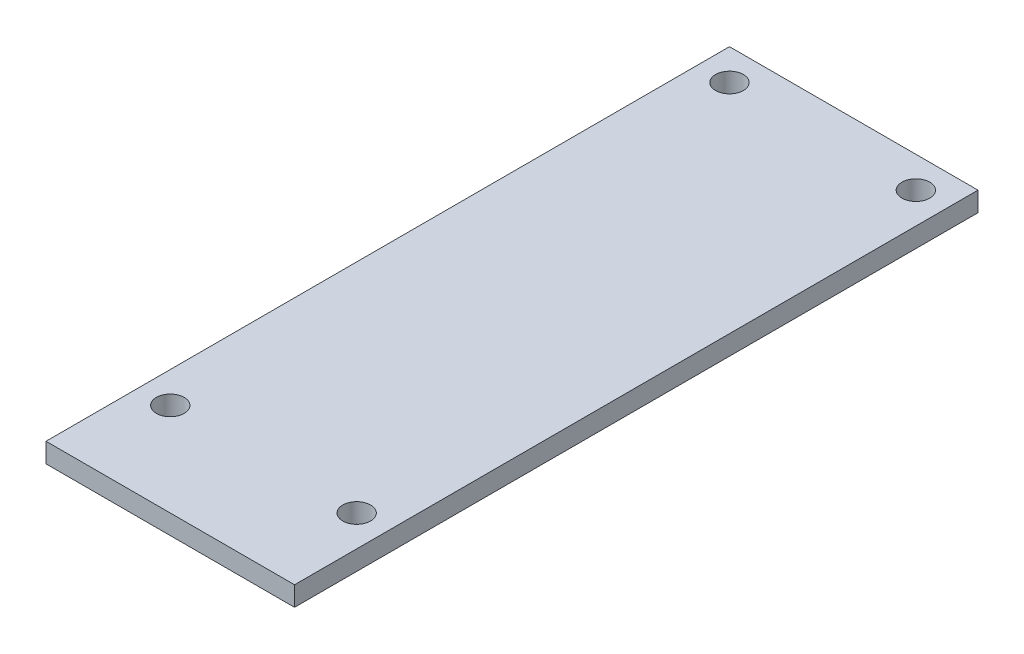
ISO-10303-21;
HEADER;
FILE_DESCRIPTION(('STEP AP214'),'2;1');
FILE_NAME('part.step','',(''),(''),'','','');
FILE_SCHEMA(('AUTOMOTIVE_DESIGN { 1 0 10303 214 1 1 1 1 }'));
ENDSEC;
DATA;
#1=APPLICATION_CONTEXT('core data for automotive mechanical design processes');
#2=APPLICATION_PROTOCOL_DEFINITION('international standard','automotive_design',2000,#1);
#3=PRODUCT_CONTEXT('',#1,'mechanical');
#4=PRODUCT('Part','Part','',(#3));
#5=PRODUCT_RELATED_PRODUCT_CATEGORY('part','',(#4));
#6=PRODUCT_DEFINITION_FORMATION('','',#4);
#7=PRODUCT_DEFINITION_CONTEXT('part definition',#1,'design');
#8=PRODUCT_DEFINITION('design','',#6,#7);
#9=PRODUCT_DEFINITION_SHAPE('','',#8);
#10=(LENGTH_UNIT() NAMED_UNIT(*) SI_UNIT(.MILLI.,.METRE.));
#11=(NAMED_UNIT(*) PLANE_ANGLE_UNIT() SI_UNIT($,.RADIAN.));
#12=(NAMED_UNIT(*) SI_UNIT($,.STERADIAN.) SOLID_ANGLE_UNIT());
#13=UNCERTAINTY_MEASURE_WITH_UNIT(LENGTH_MEASURE(1.E-05),#10,'distance_accuracy_value','');
#14=(GEOMETRIC_REPRESENTATION_CONTEXT(3) GLOBAL_UNCERTAINTY_ASSIGNED_CONTEXT((#13)) GLOBAL_UNIT_ASSIGNED_CONTEXT((#10,
#11,#12)) REPRESENTATION_CONTEXT('',''));
#15=CARTESIAN_POINT('',(0.,0.,0.));
#16=DIRECTION('',(0.,0.,1.));
#17=DIRECTION('',(1.,0.,0.));
#18=AXIS2_PLACEMENT_3D('',#15,#16,#17);
#19=CARTESIAN_POINT('',(0.,2.,0.));
#20=DIRECTION('',(1.,0.,0.));
#21=DIRECTION('',(0.,0.,-1.));
#22=AXIS2_PLACEMENT_3D('',#19,#20,#21);
#23=PLANE('',#22);
#24=DIRECTION('',(0.,0.,1.));
#25=VECTOR('',#24,1.);
#26=CARTESIAN_POINT('',(0.,0.,0.));
#27=LINE('',#26,#25);
#28=CARTESIAN_POINT('',(0.,0.,-69.85));
#29=VERTEX_POINT('',#28);
#30=CARTESIAN_POINT('',(0.,0.,0.));
#31=VERTEX_POINT('',#30);
#32=EDGE_CURVE('E98',#29,#31,#27,.T.);
#33=ORIENTED_EDGE('',*,*,#32,.T.);
#34=DIRECTION('',(0.,-1.,0.));
#35=VECTOR('',#34,1.);
#36=CARTESIAN_POINT('',(0.,2.,0.));
#37=LINE('',#36,#35);
#38=CARTESIAN_POINT('',(0.,2.,0.));
#39=VERTEX_POINT('',#38);
#40=EDGE_CURVE('E11',#39,#31,#37,.T.);
#41=ORIENTED_EDGE('',*,*,#40,.F.);
#42=DIRECTION('',(0.,0.,1.));
#43=VECTOR('',#42,1.);
#44=CARTESIAN_POINT('',(0.,2.,0.));
#45=LINE('',#44,#43);
#46=CARTESIAN_POINT('',(0.,2.,-69.85));
#47=VERTEX_POINT('',#46);
#48=EDGE_CURVE('E86',#47,#39,#45,.T.);
#49=ORIENTED_EDGE('',*,*,#48,.F.);
#50=DIRECTION('',(0.,-1.,0.));
#51=VECTOR('',#50,1.);
#52=CARTESIAN_POINT('',(0.,2.,-69.85));
#53=LINE('',#52,#51);
#54=EDGE_CURVE('E94',#47,#29,#53,.T.);
#55=ORIENTED_EDGE('',*,*,#54,.T.);
#56=EDGE_LOOP('',(#33,#41,#49,#55));
#57=FACE_BOUND('',#56,.T.);
#58=ADVANCED_FACE('F35',(#57),#23,.F.);
#59=CARTESIAN_POINT('',(0.,2.,0.));
#60=DIRECTION('',(0.,0.,-1.));
#61=DIRECTION('',(-1.,0.,0.));
#62=AXIS2_PLACEMENT_3D('',#59,#60,#61);
#63=PLANE('',#62);
#64=DIRECTION('',(1.,0.,0.));
#65=VECTOR('',#64,1.);
#66=CARTESIAN_POINT('',(0.,0.,0.));
#67=LINE('',#66,#65);
#68=CARTESIAN_POINT('',(25.4,0.,0.));
#69=VERTEX_POINT('',#68);
#70=EDGE_CURVE('E90',#31,#69,#67,.T.);
#71=ORIENTED_EDGE('',*,*,#70,.T.);
#72=DIRECTION('',(0.,-1.,0.));
#73=VECTOR('',#72,1.);
#74=CARTESIAN_POINT('',(25.4,2.,0.));
#75=LINE('',#74,#73);
#76=CARTESIAN_POINT('',(25.4,2.,0.));
#77=VERTEX_POINT('',#76);
#78=EDGE_CURVE('E43',#77,#69,#75,.T.);
#79=ORIENTED_EDGE('',*,*,#78,.F.);
#80=DIRECTION('',(1.,0.,0.));
#81=VECTOR('',#80,1.);
#82=CARTESIAN_POINT('',(0.,2.,0.));
#83=LINE('',#82,#81);
#84=EDGE_CURVE('E81',#39,#77,#83,.T.);
#85=ORIENTED_EDGE('',*,*,#84,.F.);
#86=ORIENTED_EDGE('',*,*,#40,.T.);
#87=EDGE_LOOP('',(#71,#79,#85,#86));
#88=FACE_BOUND('',#87,.T.);
#89=ADVANCED_FACE('F89',(#88),#63,.F.);
#90=CARTESIAN_POINT('',(25.4,2.,0.));
#91=DIRECTION('',(-1.,0.,0.));
#92=DIRECTION('',(0.,0.,1.));
#93=AXIS2_PLACEMENT_3D('',#90,#91,#92);
#94=PLANE('',#93);
#95=DIRECTION('',(0.,0.,-1.));
#96=VECTOR('',#95,1.);
#97=CARTESIAN_POINT('',(25.4,0.,0.));
#98=LINE('',#97,#96);
#99=CARTESIAN_POINT('',(25.4,0.,-69.85));
#100=VERTEX_POINT('',#99);
#101=EDGE_CURVE('E68',#69,#100,#98,.T.);
#102=ORIENTED_EDGE('',*,*,#101,.T.);
#103=DIRECTION('',(0.,-1.,0.));
#104=VECTOR('',#103,1.);
#105=CARTESIAN_POINT('',(25.4,2.,-69.85));
#106=LINE('',#105,#104);
#107=CARTESIAN_POINT('',(25.4,2.,-69.85));
#108=VERTEX_POINT('',#107);
#109=EDGE_CURVE('E91',#108,#100,#106,.T.);
#110=ORIENTED_EDGE('',*,*,#109,.F.);
#111=DIRECTION('',(0.,0.,-1.));
#112=VECTOR('',#111,1.);
#113=CARTESIAN_POINT('',(25.4,2.,0.));
#114=LINE('',#113,#112);
#115=EDGE_CURVE('E84',#77,#108,#114,.T.);
#116=ORIENTED_EDGE('',*,*,#115,.F.);
#117=ORIENTED_EDGE('',*,*,#78,.T.);
#118=EDGE_LOOP('',(#102,#110,#116,#117));
#119=FACE_BOUND('',#118,.T.);
#120=ADVANCED_FACE('F92',(#119),#94,.F.);
#121=CARTESIAN_POINT('',(0.,2.,-69.85));
#122=DIRECTION('',(0.,0.,1.));
#123=DIRECTION('',(1.,0.,0.));
#124=AXIS2_PLACEMENT_3D('',#121,#122,#123);
#125=PLANE('',#124);
#126=DIRECTION('',(-1.,0.,0.));
#127=VECTOR('',#126,1.);
#128=CARTESIAN_POINT('',(0.,0.,-69.85));
#129=LINE('',#128,#127);
#130=EDGE_CURVE('E74',#100,#29,#129,.T.);
#131=ORIENTED_EDGE('',*,*,#130,.T.);
#132=ORIENTED_EDGE('',*,*,#54,.F.);
#133=DIRECTION('',(-1.,0.,0.));
#134=VECTOR('',#133,1.);
#135=CARTESIAN_POINT('',(0.,2.,-69.85));
#136=LINE('',#135,#134);
#137=EDGE_CURVE('E51',#108,#47,#136,.T.);
#138=ORIENTED_EDGE('',*,*,#137,.F.);
#139=ORIENTED_EDGE('',*,*,#109,.T.);
#140=EDGE_LOOP('',(#131,#132,#138,#139));
#141=FACE_BOUND('',#140,.T.);
#142=ADVANCED_FACE('F106',(#141),#125,.F.);
#143=CARTESIAN_POINT('',(0.,2.,0.));
#144=DIRECTION('',(0.,-1.,0.));
#145=DIRECTION('',(0.,0.,-1.));
#146=AXIS2_PLACEMENT_3D('',#143,#144,#145);
#147=PLANE('',#146);
#148=CARTESIAN_POINT('',(22.225,2.,-9.525));
#149=DIRECTION('',(0.,1.,0.));
#150=DIRECTION('',(0.,0.,1.));
#151=AXIS2_PLACEMENT_3D('',#148,#149,#150);
#152=CIRCLE('',#151,1.4224);
#153=CARTESIAN_POINT('',(22.225,2.,-8.1026));
#154=VERTEX_POINT('',#153);
#155=EDGE_CURVE('E130',#154,#154,#152,.T.);
#156=ORIENTED_EDGE('',*,*,#155,.F.);
#157=EDGE_LOOP('',(#156));
#158=FACE_BOUND('',#157,.T.);
#159=CARTESIAN_POINT('',(3.17500000000001,2.,-9.525));
#160=DIRECTION('',(0.,1.,0.));
#161=DIRECTION('',(0.,0.,1.));
#162=AXIS2_PLACEMENT_3D('',#159,#160,#161);
#163=CIRCLE('',#162,1.4224);
#164=CARTESIAN_POINT('',(3.17500000000001,2.,-8.1026));
#165=VERTEX_POINT('',#164);
#166=EDGE_CURVE('E124',#165,#165,#163,.T.);
#167=ORIENTED_EDGE('',*,*,#166,.F.);
#168=EDGE_LOOP('',(#167));
#169=FACE_BOUND('',#168,.T.);
#170=CARTESIAN_POINT('',(22.225,2.,-66.675));
#171=DIRECTION('',(0.,1.,0.));
#172=DIRECTION('',(0.,0.,1.));
#173=AXIS2_PLACEMENT_3D('',#170,#171,#172);
#174=CIRCLE('',#173,1.4224);
#175=CARTESIAN_POINT('',(22.225,2.,-65.2526));
#176=VERTEX_POINT('',#175);
#177=EDGE_CURVE('E118',#176,#176,#174,.T.);
#178=ORIENTED_EDGE('',*,*,#177,.F.);
#179=EDGE_LOOP('',(#178));
#180=FACE_BOUND('',#179,.T.);
#181=CARTESIAN_POINT('',(3.175,2.,-66.675));
#182=DIRECTION('',(0.,1.,0.));
#183=DIRECTION('',(0.,0.,1.));
#184=AXIS2_PLACEMENT_3D('',#181,#182,#183);
#185=CIRCLE('',#184,1.4224);
#186=CARTESIAN_POINT('',(3.175,2.,-65.2526));
#187=VERTEX_POINT('',#186);
#188=EDGE_CURVE('E112',#187,#187,#185,.T.);
#189=ORIENTED_EDGE('',*,*,#188,.F.);
#190=EDGE_LOOP('',(#189));
#191=FACE_BOUND('',#190,.T.);
#192=ORIENTED_EDGE('',*,*,#48,.T.);
#193=ORIENTED_EDGE('',*,*,#84,.T.);
#194=ORIENTED_EDGE('',*,*,#115,.T.);
#195=ORIENTED_EDGE('',*,*,#137,.T.);
#196=EDGE_LOOP('',(#192,#193,#194,#195));
#197=FACE_BOUND('',#196,.T.);
#198=ADVANCED_FACE('F82',(#158,#169,#180,#191,#197),#147,.F.);
#199=CARTESIAN_POINT('',(0.,0.,0.));
#200=DIRECTION('',(0.,-1.,0.));
#201=DIRECTION('',(0.,0.,-1.));
#202=AXIS2_PLACEMENT_3D('',#199,#200,#201);
#203=PLANE('',#202);
#204=CARTESIAN_POINT('',(22.225,0.,-9.525));
#205=DIRECTION('',(0.,1.,0.));
#206=DIRECTION('',(0.,0.,1.));
#207=AXIS2_PLACEMENT_3D('',#204,#205,#206);
#208=CIRCLE('',#207,1.4224);
#209=CARTESIAN_POINT('',(22.225,0.,-8.1026));
#210=VERTEX_POINT('',#209);
#211=EDGE_CURVE('E127',#210,#210,#208,.T.);
#212=ORIENTED_EDGE('',*,*,#211,.T.);
#213=EDGE_LOOP('',(#212));
#214=FACE_BOUND('',#213,.T.);
#215=CARTESIAN_POINT('',(3.17500000000001,0.,-9.525));
#216=DIRECTION('',(0.,1.,0.));
#217=DIRECTION('',(0.,0.,1.));
#218=AXIS2_PLACEMENT_3D('',#215,#216,#217);
#219=CIRCLE('',#218,1.4224);
#220=CARTESIAN_POINT('',(3.17500000000001,0.,-8.1026));
#221=VERTEX_POINT('',#220);
#222=EDGE_CURVE('E121',#221,#221,#219,.T.);
#223=ORIENTED_EDGE('',*,*,#222,.T.);
#224=EDGE_LOOP('',(#223));
#225=FACE_BOUND('',#224,.T.);
#226=CARTESIAN_POINT('',(22.225,0.,-66.675));
#227=DIRECTION('',(0.,1.,0.));
#228=DIRECTION('',(0.,0.,1.));
#229=AXIS2_PLACEMENT_3D('',#226,#227,#228);
#230=CIRCLE('',#229,1.4224);
#231=CARTESIAN_POINT('',(22.225,0.,-65.2526));
#232=VERTEX_POINT('',#231);
#233=EDGE_CURVE('E115',#232,#232,#230,.T.);
#234=ORIENTED_EDGE('',*,*,#233,.T.);
#235=EDGE_LOOP('',(#234));
#236=FACE_BOUND('',#235,.T.);
#237=CARTESIAN_POINT('',(3.175,0.,-66.675));
#238=DIRECTION('',(0.,1.,0.));
#239=DIRECTION('',(0.,0.,1.));
#240=AXIS2_PLACEMENT_3D('',#237,#238,#239);
#241=CIRCLE('',#240,1.4224);
#242=CARTESIAN_POINT('',(3.175,0.,-65.2526));
#243=VERTEX_POINT('',#242);
#244=EDGE_CURVE('E101',#243,#243,#241,.T.);
#245=ORIENTED_EDGE('',*,*,#244,.T.);
#246=EDGE_LOOP('',(#245));
#247=FACE_BOUND('',#246,.T.);
#248=ORIENTED_EDGE('',*,*,#32,.F.);
#249=ORIENTED_EDGE('',*,*,#130,.F.);
#250=ORIENTED_EDGE('',*,*,#101,.F.);
#251=ORIENTED_EDGE('',*,*,#70,.F.);
#252=EDGE_LOOP('',(#248,#249,#250,#251));
#253=FACE_BOUND('',#252,.T.);
#254=ADVANCED_FACE('F109',(#214,#225,#236,#247,#253),#203,.T.);
#255=CARTESIAN_POINT('',(3.175,0.,-66.675));
#256=DIRECTION('',(0.,1.,0.));
#257=DIRECTION('',(0.,0.,1.));
#258=AXIS2_PLACEMENT_3D('',#255,#256,#257);
#259=CYLINDRICAL_SURFACE('',#258,1.4224);
#260=ORIENTED_EDGE('',*,*,#244,.F.);
#261=EDGE_LOOP('',(#260));
#262=FACE_BOUND('',#261,.T.);
#263=ORIENTED_EDGE('',*,*,#188,.T.);
#264=EDGE_LOOP('',(#263));
#265=FACE_BOUND('',#264,.T.);
#266=ADVANCED_FACE('F154',(#262,#265),#259,.F.);
#267=CARTESIAN_POINT('',(22.225,0.,-66.675));
#268=DIRECTION('',(0.,1.,0.));
#269=DIRECTION('',(0.,0.,1.));
#270=AXIS2_PLACEMENT_3D('',#267,#268,#269);
#271=CYLINDRICAL_SURFACE('',#270,1.4224);
#272=ORIENTED_EDGE('',*,*,#233,.F.);
#273=EDGE_LOOP('',(#272));
#274=FACE_BOUND('',#273,.T.);
#275=ORIENTED_EDGE('',*,*,#177,.T.);
#276=EDGE_LOOP('',(#275));
#277=FACE_BOUND('',#276,.T.);
#278=ADVANCED_FACE('F156',(#274,#277),#271,.F.);
#279=CARTESIAN_POINT('',(3.17500000000001,0.,-9.525));
#280=DIRECTION('',(0.,1.,0.));
#281=DIRECTION('',(0.,0.,1.));
#282=AXIS2_PLACEMENT_3D('',#279,#280,#281);
#283=CYLINDRICAL_SURFACE('',#282,1.4224);
#284=ORIENTED_EDGE('',*,*,#222,.F.);
#285=EDGE_LOOP('',(#284));
#286=FACE_BOUND('',#285,.T.);
#287=ORIENTED_EDGE('',*,*,#166,.T.);
#288=EDGE_LOOP('',(#287));
#289=FACE_BOUND('',#288,.T.);
#290=ADVANCED_FACE('F141',(#286,#289),#283,.F.);
#291=CARTESIAN_POINT('',(22.225,0.,-9.525));
#292=DIRECTION('',(0.,1.,0.));
#293=DIRECTION('',(0.,0.,1.));
#294=AXIS2_PLACEMENT_3D('',#291,#292,#293);
#295=CYLINDRICAL_SURFACE('',#294,1.4224);
#296=ORIENTED_EDGE('',*,*,#211,.F.);
#297=EDGE_LOOP('',(#296));
#298=FACE_BOUND('',#297,.T.);
#299=ORIENTED_EDGE('',*,*,#155,.T.);
#300=EDGE_LOOP('',(#299));
#301=FACE_BOUND('',#300,.T.);
#302=ADVANCED_FACE('F138',(#298,#301),#295,.F.);
#303=CLOSED_SHELL('',(#58,#89,#120,#142,#198,#254,#266,#278,#290,#302));
#304=MANIFOLD_SOLID_BREP('B2',#303);
#305=ADVANCED_BREP_SHAPE_REPRESENTATION('',(#18,#304),#14);
#306=SHAPE_DEFINITION_REPRESENTATION(#9,#305);
ENDSEC;
END-ISO-10303-21;
